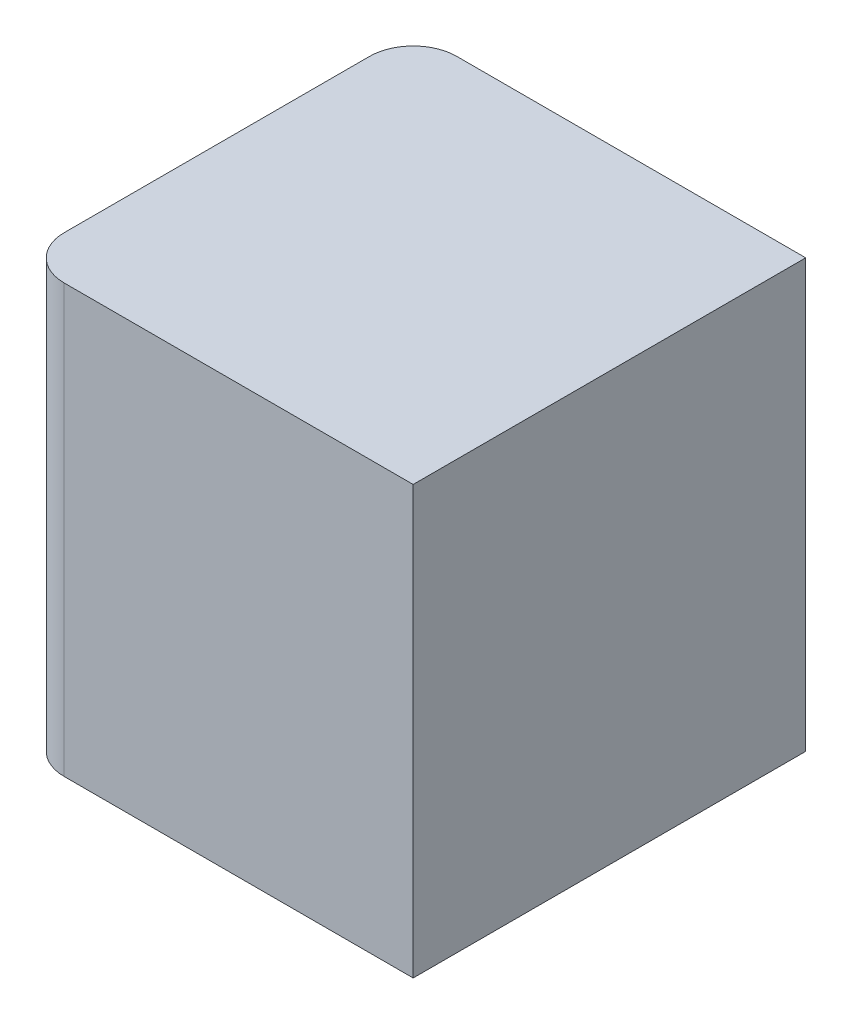
ISO-10303-21;
HEADER;
FILE_DESCRIPTION(('STEP AP214'),'2;1');
FILE_NAME('part.step','',(''),(''),'','','');
FILE_SCHEMA(('AUTOMOTIVE_DESIGN { 1 0 10303 214 1 1 1 1 }'));
ENDSEC;
DATA;
#1=APPLICATION_CONTEXT('core data for automotive mechanical design processes');
#2=APPLICATION_PROTOCOL_DEFINITION('international standard','automotive_design',2000,#1);
#3=PRODUCT_CONTEXT('',#1,'mechanical');
#4=PRODUCT('Part','Part','',(#3));
#5=PRODUCT_RELATED_PRODUCT_CATEGORY('part','',(#4));
#6=PRODUCT_DEFINITION_FORMATION('','',#4);
#7=PRODUCT_DEFINITION_CONTEXT('part definition',#1,'design');
#8=PRODUCT_DEFINITION('design','',#6,#7);
#9=PRODUCT_DEFINITION_SHAPE('','',#8);
#10=(LENGTH_UNIT() NAMED_UNIT(*) SI_UNIT(.MILLI.,.METRE.));
#11=(NAMED_UNIT(*) PLANE_ANGLE_UNIT() SI_UNIT($,.RADIAN.));
#12=(NAMED_UNIT(*) SI_UNIT($,.STERADIAN.) SOLID_ANGLE_UNIT());
#13=UNCERTAINTY_MEASURE_WITH_UNIT(LENGTH_MEASURE(1.E-05),#10,'distance_accuracy_value','');
#14=(GEOMETRIC_REPRESENTATION_CONTEXT(3) GLOBAL_UNCERTAINTY_ASSIGNED_CONTEXT((#13)) GLOBAL_UNIT_ASSIGNED_CONTEXT((#10,
#11,#12)) REPRESENTATION_CONTEXT('',''));
#15=CARTESIAN_POINT('',(0.,0.,0.));
#16=DIRECTION('',(0.,0.,1.));
#17=DIRECTION('',(1.,0.,0.));
#18=AXIS2_PLACEMENT_3D('',#15,#16,#17);
#19=CARTESIAN_POINT('',(0.,24.892,0.));
#20=DIRECTION('',(1.,0.,0.));
#21=DIRECTION('',(0.,0.,-1.));
#22=AXIS2_PLACEMENT_3D('',#19,#20,#21);
#23=PLANE('',#22);
#24=DIRECTION('',(0.,0.,1.));
#25=VECTOR('',#24,1.);
#26=CARTESIAN_POINT('',(0.,24.892,0.));
#27=LINE('',#26,#25);
#28=CARTESIAN_POINT('',(0.,24.892,2.54));
#29=VERTEX_POINT('',#28);
#30=CARTESIAN_POINT('',(0.,24.892,20.32));
#31=VERTEX_POINT('',#30);
#32=EDGE_CURVE('E94',#29,#31,#27,.T.);
#33=ORIENTED_EDGE('',*,*,#32,.F.);
#34=DIRECTION('',(0.,-1.,0.));
#35=VECTOR('',#34,1.);
#36=CARTESIAN_POINT('',(0.,24.892,2.54));
#37=LINE('',#36,#35);
#38=CARTESIAN_POINT('',(0.,0.,2.54));
#39=VERTEX_POINT('',#38);
#40=EDGE_CURVE('E123',#29,#39,#37,.T.);
#41=ORIENTED_EDGE('',*,*,#40,.T.);
#42=DIRECTION('',(0.,0.,1.));
#43=VECTOR('',#42,1.);
#44=CARTESIAN_POINT('',(0.,0.,0.));
#45=LINE('',#44,#43);
#46=CARTESIAN_POINT('',(0.,0.,20.32));
#47=VERTEX_POINT('',#46);
#48=EDGE_CURVE('E113',#39,#47,#45,.T.);
#49=ORIENTED_EDGE('',*,*,#48,.T.);
#50=DIRECTION('',(0.,-1.,0.));
#51=VECTOR('',#50,1.);
#52=CARTESIAN_POINT('',(0.,24.892,20.32));
#53=LINE('',#52,#51);
#54=EDGE_CURVE('E103',#47,#31,#53,.F.);
#55=ORIENTED_EDGE('',*,*,#54,.T.);
#56=EDGE_LOOP('',(#33,#41,#49,#55));
#57=FACE_BOUND('',#56,.T.);
#58=ADVANCED_FACE('F33',(#57),#23,.F.);
#59=CARTESIAN_POINT('',(0.,24.892,22.86));
#60=DIRECTION('',(0.,0.,-1.));
#61=DIRECTION('',(-1.,0.,0.));
#62=AXIS2_PLACEMENT_3D('',#59,#60,#61);
#63=PLANE('',#62);
#64=DIRECTION('',(1.,0.,0.));
#65=VECTOR('',#64,1.);
#66=CARTESIAN_POINT('',(0.,24.892,22.86));
#67=LINE('',#66,#65);
#68=CARTESIAN_POINT('',(2.54,24.892,22.86));
#69=VERTEX_POINT('',#68);
#70=CARTESIAN_POINT('',(22.86,24.892,22.86));
#71=VERTEX_POINT('',#70);
#72=EDGE_CURVE('E86',#69,#71,#67,.T.);
#73=ORIENTED_EDGE('',*,*,#72,.F.);
#74=DIRECTION('',(0.,-1.,0.));
#75=VECTOR('',#74,1.);
#76=CARTESIAN_POINT('',(2.54,24.892,22.86));
#77=LINE('',#76,#75);
#78=CARTESIAN_POINT('',(2.54,0.,22.86));
#79=VERTEX_POINT('',#78);
#80=EDGE_CURVE('E11',#69,#79,#77,.T.);
#81=ORIENTED_EDGE('',*,*,#80,.T.);
#82=DIRECTION('',(1.,0.,0.));
#83=VECTOR('',#82,1.);
#84=CARTESIAN_POINT('',(0.,0.,22.86));
#85=LINE('',#84,#83);
#86=CARTESIAN_POINT('',(22.86,0.,22.86));
#87=VERTEX_POINT('',#86);
#88=EDGE_CURVE('E100',#79,#87,#85,.T.);
#89=ORIENTED_EDGE('',*,*,#88,.T.);
#90=DIRECTION('',(0.,-1.,0.));
#91=VECTOR('',#90,1.);
#92=CARTESIAN_POINT('',(22.86,24.892,22.86));
#93=LINE('',#92,#91);
#94=EDGE_CURVE('E97',#71,#87,#93,.T.);
#95=ORIENTED_EDGE('',*,*,#94,.F.);
#96=EDGE_LOOP('',(#73,#81,#89,#95));
#97=FACE_BOUND('',#96,.T.);
#98=ADVANCED_FACE('F98',(#97),#63,.F.);
#99=CARTESIAN_POINT('',(22.86,24.892,0.));
#100=DIRECTION('',(-1.,0.,0.));
#101=DIRECTION('',(0.,0.,1.));
#102=AXIS2_PLACEMENT_3D('',#99,#100,#101);
#103=PLANE('',#102);
#104=DIRECTION('',(0.,0.,-1.));
#105=VECTOR('',#104,1.);
#106=CARTESIAN_POINT('',(22.86,0.,0.));
#107=LINE('',#106,#105);
#108=CARTESIAN_POINT('',(22.86,0.,0.));
#109=VERTEX_POINT('',#108);
#110=EDGE_CURVE('E117',#87,#109,#107,.T.);
#111=ORIENTED_EDGE('',*,*,#110,.T.);
#112=DIRECTION('',(0.,-1.,0.));
#113=VECTOR('',#112,1.);
#114=CARTESIAN_POINT('',(22.86,24.892,0.));
#115=LINE('',#114,#113);
#116=CARTESIAN_POINT('',(22.86,24.892,0.));
#117=VERTEX_POINT('',#116);
#118=EDGE_CURVE('E104',#117,#109,#115,.T.);
#119=ORIENTED_EDGE('',*,*,#118,.F.);
#120=DIRECTION('',(0.,0.,-1.));
#121=VECTOR('',#120,1.);
#122=CARTESIAN_POINT('',(22.86,24.892,0.));
#123=LINE('',#122,#121);
#124=EDGE_CURVE('E90',#71,#117,#123,.T.);
#125=ORIENTED_EDGE('',*,*,#124,.F.);
#126=ORIENTED_EDGE('',*,*,#94,.T.);
#127=EDGE_LOOP('',(#111,#119,#125,#126));
#128=FACE_BOUND('',#127,.T.);
#129=ADVANCED_FACE('F106',(#128),#103,.F.);
#130=CARTESIAN_POINT('',(0.,24.892,0.));
#131=DIRECTION('',(0.,0.,1.));
#132=DIRECTION('',(1.,0.,0.));
#133=AXIS2_PLACEMENT_3D('',#130,#131,#132);
#134=PLANE('',#133);
#135=DIRECTION('',(-1.,0.,0.));
#136=VECTOR('',#135,1.);
#137=CARTESIAN_POINT('',(0.,0.,0.));
#138=LINE('',#137,#136);
#139=CARTESIAN_POINT('',(2.54,0.,0.));
#140=VERTEX_POINT('',#139);
#141=EDGE_CURVE('E119',#109,#140,#138,.T.);
#142=ORIENTED_EDGE('',*,*,#141,.T.);
#143=DIRECTION('',(0.,-1.,0.));
#144=VECTOR('',#143,1.);
#145=CARTESIAN_POINT('',(2.54,24.892,0.));
#146=LINE('',#145,#144);
#147=CARTESIAN_POINT('',(2.54,24.892,0.));
#148=VERTEX_POINT('',#147);
#149=EDGE_CURVE('E56',#140,#148,#146,.F.);
#150=ORIENTED_EDGE('',*,*,#149,.T.);
#151=DIRECTION('',(-1.,0.,0.));
#152=VECTOR('',#151,1.);
#153=CARTESIAN_POINT('',(0.,24.892,0.));
#154=LINE('',#153,#152);
#155=EDGE_CURVE('E108',#117,#148,#154,.T.);
#156=ORIENTED_EDGE('',*,*,#155,.F.);
#157=ORIENTED_EDGE('',*,*,#118,.T.);
#158=EDGE_LOOP('',(#142,#150,#156,#157));
#159=FACE_BOUND('',#158,.T.);
#160=ADVANCED_FACE('F142',(#159),#134,.F.);
#161=CARTESIAN_POINT('',(0.,24.892,0.));
#162=DIRECTION('',(0.,1.,0.));
#163=DIRECTION('',(0.,0.,1.));
#164=AXIS2_PLACEMENT_3D('',#161,#162,#163);
#165=PLANE('',#164);
#166=ORIENTED_EDGE('',*,*,#155,.T.);
#167=CARTESIAN_POINT('',(2.54,24.892,2.54));
#168=DIRECTION('',(0.,1.,0.));
#169=DIRECTION('',(0.,0.,1.));
#170=AXIS2_PLACEMENT_3D('',#167,#168,#169);
#171=CIRCLE('',#170,2.54);
#172=EDGE_CURVE('E41',#148,#29,#171,.T.);
#173=ORIENTED_EDGE('',*,*,#172,.T.);
#174=ORIENTED_EDGE('',*,*,#32,.T.);
#175=CARTESIAN_POINT('',(2.54,24.892,20.32));
#176=DIRECTION('',(0.,1.,0.));
#177=DIRECTION('',(0.,0.,1.));
#178=AXIS2_PLACEMENT_3D('',#175,#176,#177);
#179=CIRCLE('',#178,2.54);
#180=EDGE_CURVE('E48',#31,#69,#179,.T.);
#181=ORIENTED_EDGE('',*,*,#180,.T.);
#182=ORIENTED_EDGE('',*,*,#72,.T.);
#183=ORIENTED_EDGE('',*,*,#124,.T.);
#184=EDGE_LOOP('',(#166,#173,#174,#181,#182,#183));
#185=FACE_BOUND('',#184,.T.);
#186=ADVANCED_FACE('F88',(#185),#165,.T.);
#187=CARTESIAN_POINT('',(0.,0.,0.));
#188=DIRECTION('',(0.,1.,0.));
#189=DIRECTION('',(0.,0.,1.));
#190=AXIS2_PLACEMENT_3D('',#187,#188,#189);
#191=PLANE('',#190);
#192=ORIENTED_EDGE('',*,*,#48,.F.);
#193=CARTESIAN_POINT('',(2.54,0.,2.54));
#194=DIRECTION('',(0.,1.,0.));
#195=DIRECTION('',(0.,0.,1.));
#196=AXIS2_PLACEMENT_3D('',#193,#194,#195);
#197=CIRCLE('',#196,2.54);
#198=EDGE_CURVE('E128',#39,#140,#197,.F.);
#199=ORIENTED_EDGE('',*,*,#198,.T.);
#200=ORIENTED_EDGE('',*,*,#141,.F.);
#201=ORIENTED_EDGE('',*,*,#110,.F.);
#202=ORIENTED_EDGE('',*,*,#88,.F.);
#203=CARTESIAN_POINT('',(2.54,0.,20.32));
#204=DIRECTION('',(0.,1.,0.));
#205=DIRECTION('',(0.,0.,1.));
#206=AXIS2_PLACEMENT_3D('',#203,#204,#205);
#207=CIRCLE('',#206,2.54);
#208=EDGE_CURVE('E126',#79,#47,#207,.F.);
#209=ORIENTED_EDGE('',*,*,#208,.T.);
#210=EDGE_LOOP('',(#192,#199,#200,#201,#202,#209));
#211=FACE_BOUND('',#210,.T.);
#212=ADVANCED_FACE('F141',(#211),#191,.F.);
#213=CARTESIAN_POINT('',(2.54,24.892,2.54));
#214=DIRECTION('',(0.,-1.,0.));
#215=DIRECTION('',(0.,0.,-1.));
#216=AXIS2_PLACEMENT_3D('',#213,#214,#215);
#217=CYLINDRICAL_SURFACE('',#216,2.54);
#218=ORIENTED_EDGE('',*,*,#172,.F.);
#219=ORIENTED_EDGE('',*,*,#149,.F.);
#220=ORIENTED_EDGE('',*,*,#198,.F.);
#221=ORIENTED_EDGE('',*,*,#40,.F.);
#222=EDGE_LOOP('',(#218,#219,#220,#221));
#223=FACE_BOUND('',#222,.T.);
#224=ADVANCED_FACE('F138',(#223),#217,.T.);
#225=CARTESIAN_POINT('',(2.54,24.892,20.32));
#226=DIRECTION('',(0.,-1.,0.));
#227=DIRECTION('',(0.,0.,-1.));
#228=AXIS2_PLACEMENT_3D('',#225,#226,#227);
#229=CYLINDRICAL_SURFACE('',#228,2.54);
#230=ORIENTED_EDGE('',*,*,#180,.F.);
#231=ORIENTED_EDGE('',*,*,#54,.F.);
#232=ORIENTED_EDGE('',*,*,#208,.F.);
#233=ORIENTED_EDGE('',*,*,#80,.F.);
#234=EDGE_LOOP('',(#230,#231,#232,#233));
#235=FACE_BOUND('',#234,.T.);
#236=ADVANCED_FACE('F35',(#235),#229,.T.);
#237=CLOSED_SHELL('',(#58,#98,#129,#160,#186,#212,#224,#236));
#238=MANIFOLD_SOLID_BREP('B2',#237);
#239=ADVANCED_BREP_SHAPE_REPRESENTATION('',(#18,#238),#14);
#240=SHAPE_DEFINITION_REPRESENTATION(#9,#239);
ENDSEC;
END-ISO-10303-21;
